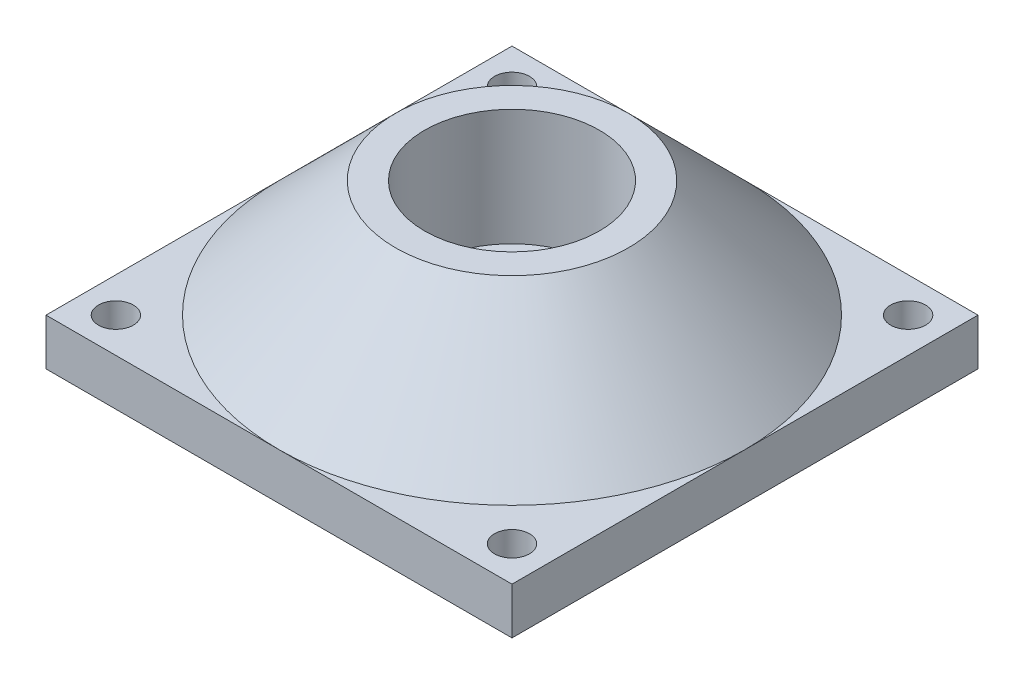
ISO-10303-21;
HEADER;
FILE_DESCRIPTION(('STEP AP214'),'2;1');
FILE_NAME('part.step','',(''),(''),'','','');
FILE_SCHEMA(('AUTOMOTIVE_DESIGN { 1 0 10303 214 1 1 1 1 }'));
ENDSEC;
DATA;
#1=APPLICATION_CONTEXT('core data for automotive mechanical design processes');
#2=APPLICATION_PROTOCOL_DEFINITION('international standard','automotive_design',2000,#1);
#3=PRODUCT_CONTEXT('',#1,'mechanical');
#4=PRODUCT('Part','Part','',(#3));
#5=PRODUCT_RELATED_PRODUCT_CATEGORY('part','',(#4));
#6=PRODUCT_DEFINITION_FORMATION('','',#4);
#7=PRODUCT_DEFINITION_CONTEXT('part definition',#1,'design');
#8=PRODUCT_DEFINITION('design','',#6,#7);
#9=PRODUCT_DEFINITION_SHAPE('','',#8);
#10=(LENGTH_UNIT() NAMED_UNIT(*) SI_UNIT(.MILLI.,.METRE.));
#11=(NAMED_UNIT(*) PLANE_ANGLE_UNIT() SI_UNIT($,.RADIAN.));
#12=(NAMED_UNIT(*) SI_UNIT($,.STERADIAN.) SOLID_ANGLE_UNIT());
#13=UNCERTAINTY_MEASURE_WITH_UNIT(LENGTH_MEASURE(1.E-05),#10,'distance_accuracy_value','');
#14=(GEOMETRIC_REPRESENTATION_CONTEXT(3) GLOBAL_UNCERTAINTY_ASSIGNED_CONTEXT((#13)) GLOBAL_UNIT_ASSIGNED_CONTEXT((#10,
#11,#12)) REPRESENTATION_CONTEXT('',''));
#15=CARTESIAN_POINT('',(0.,0.,0.));
#16=DIRECTION('',(0.,0.,1.));
#17=DIRECTION('',(1.,0.,0.));
#18=AXIS2_PLACEMENT_3D('',#15,#16,#17);
#19=CARTESIAN_POINT('',(0.,20.,0.));
#20=DIRECTION('',(0.,-1.,0.));
#21=DIRECTION('',(0.,0.,-1.));
#22=AXIS2_PLACEMENT_3D('',#19,#20,#21);
#23=PLANE('',#22);
#24=CARTESIAN_POINT('',(85.,20.,-85.));
#25=DIRECTION('',(0.,1.,0.));
#26=DIRECTION('',(0.,0.,1.));
#27=AXIS2_PLACEMENT_3D('',#24,#25,#26);
#28=CIRCLE('',#27,7.50000000000001);
#29=CARTESIAN_POINT('',(85.,20.,-77.5));
#30=VERTEX_POINT('',#29);
#31=EDGE_CURVE('E145',#30,#30,#28,.T.);
#32=ORIENTED_EDGE('',*,*,#31,.F.);
#33=EDGE_LOOP('',(#32));
#34=FACE_BOUND('',#33,.T.);
#35=DIRECTION('',(-1.,0.,0.));
#36=VECTOR('',#35,1.);
#37=CARTESIAN_POINT('',(-100.,20.,-100.));
#38=LINE('',#37,#36);
#39=CARTESIAN_POINT('',(100.,20.,-100.));
#40=VERTEX_POINT('',#39);
#41=CARTESIAN_POINT('',(0.,20.,-100.));
#42=VERTEX_POINT('',#41);
#43=EDGE_CURVE('E100',#40,#42,#38,.T.);
#44=ORIENTED_EDGE('',*,*,#43,.T.);
#45=CARTESIAN_POINT('',(0.,20.,0.));
#46=DIRECTION('',(0.,-1.,0.));
#47=DIRECTION('',(0.,0.,-1.));
#48=AXIS2_PLACEMENT_3D('',#45,#46,#47);
#49=CIRCLE('',#48,99.9999999999997);
#50=CARTESIAN_POINT('',(100.,20.,0.));
#51=VERTEX_POINT('',#50);
#52=EDGE_CURVE('E11',#42,#51,#49,.T.);
#53=ORIENTED_EDGE('',*,*,#52,.T.);
#54=DIRECTION('',(0.,0.,-1.));
#55=VECTOR('',#54,1.);
#56=CARTESIAN_POINT('',(100.,20.,100.));
#57=LINE('',#56,#55);
#58=EDGE_CURVE('E98',#51,#40,#57,.T.);
#59=ORIENTED_EDGE('',*,*,#58,.T.);
#60=EDGE_LOOP('',(#44,#53,#59));
#61=FACE_BOUND('',#60,.T.);
#62=ADVANCED_FACE('F41',(#34,#61),#23,.F.);
#63=CARTESIAN_POINT('',(85.,20.,85.));
#64=DIRECTION('',(0.,1.,0.));
#65=DIRECTION('',(0.,0.,-1.));
#66=AXIS2_PLACEMENT_3D('',#63,#64,#65);
#67=CIRCLE('',#66,7.50000000000001);
#68=CARTESIAN_POINT('',(85.,20.,77.5));
#69=VERTEX_POINT('',#68);
#70=EDGE_CURVE('E256',#69,#69,#67,.T.);
#71=ORIENTED_EDGE('',*,*,#70,.F.);
#72=EDGE_LOOP('',(#71));
#73=FACE_BOUND('',#72,.T.);
#74=CARTESIAN_POINT('',(100.,20.,100.));
#75=VERTEX_POINT('',#74);
#76=EDGE_CURVE('E106',#75,#51,#57,.T.);
#77=ORIENTED_EDGE('',*,*,#76,.T.);
#78=CARTESIAN_POINT('',(0.,20.,0.));
#79=DIRECTION('',(0.,-1.,0.));
#80=DIRECTION('',(0.,0.,-1.));
#81=AXIS2_PLACEMENT_3D('',#78,#79,#80);
#82=CIRCLE('',#81,99.9999999999997);
#83=CARTESIAN_POINT('',(0.,20.,100.));
#84=VERTEX_POINT('',#83);
#85=EDGE_CURVE('E52',#51,#84,#82,.T.);
#86=ORIENTED_EDGE('',*,*,#85,.T.);
#87=DIRECTION('',(1.,0.,0.));
#88=VECTOR('',#87,1.);
#89=CARTESIAN_POINT('',(-100.,20.,100.));
#90=LINE('',#89,#88);
#91=EDGE_CURVE('E178',#84,#75,#90,.T.);
#92=ORIENTED_EDGE('',*,*,#91,.T.);
#93=EDGE_LOOP('',(#77,#86,#92));
#94=FACE_BOUND('',#93,.T.);
#95=ADVANCED_FACE('F235',(#73,#94),#23,.F.);
#96=CARTESIAN_POINT('',(-85.,20.,85.));
#97=DIRECTION('',(0.,1.,0.));
#98=DIRECTION('',(0.,0.,1.));
#99=AXIS2_PLACEMENT_3D('',#96,#97,#98);
#100=CIRCLE('',#99,7.50000000000001);
#101=CARTESIAN_POINT('',(-85.,20.,92.5));
#102=VERTEX_POINT('',#101);
#103=EDGE_CURVE('E262',#102,#102,#100,.T.);
#104=ORIENTED_EDGE('',*,*,#103,.F.);
#105=EDGE_LOOP('',(#104));
#106=FACE_BOUND('',#105,.T.);
#107=CARTESIAN_POINT('',(-100.,20.,100.));
#108=VERTEX_POINT('',#107);
#109=EDGE_CURVE('E179',#108,#84,#90,.T.);
#110=ORIENTED_EDGE('',*,*,#109,.T.);
#111=CARTESIAN_POINT('',(0.,20.,0.));
#112=DIRECTION('',(0.,-1.,0.));
#113=DIRECTION('',(0.,0.,-1.));
#114=AXIS2_PLACEMENT_3D('',#111,#112,#113);
#115=CIRCLE('',#114,99.9999999999997);
#116=CARTESIAN_POINT('',(-100.,20.,0.));
#117=VERTEX_POINT('',#116);
#118=EDGE_CURVE('E67',#84,#117,#115,.T.);
#119=ORIENTED_EDGE('',*,*,#118,.T.);
#120=DIRECTION('',(0.,0.,1.));
#121=VECTOR('',#120,1.);
#122=CARTESIAN_POINT('',(-100.,20.,100.));
#123=LINE('',#122,#121);
#124=EDGE_CURVE('E118',#117,#108,#123,.T.);
#125=ORIENTED_EDGE('',*,*,#124,.T.);
#126=EDGE_LOOP('',(#110,#119,#125));
#127=FACE_BOUND('',#126,.T.);
#128=ADVANCED_FACE('F232',(#106,#127),#23,.F.);
#129=CARTESIAN_POINT('',(100.,20.,100.));
#130=DIRECTION('',(-1.,0.,0.));
#131=DIRECTION('',(0.,0.,1.));
#132=AXIS2_PLACEMENT_3D('',#129,#130,#131);
#133=PLANE('',#132);
#134=DIRECTION('',(0.,0.,-1.));
#135=VECTOR('',#134,1.);
#136=CARTESIAN_POINT('',(100.,0.,100.));
#137=LINE('',#136,#135);
#138=CARTESIAN_POINT('',(100.,0.,100.));
#139=VERTEX_POINT('',#138);
#140=CARTESIAN_POINT('',(100.,0.,-100.));
#141=VERTEX_POINT('',#140);
#142=EDGE_CURVE('E123',#139,#141,#137,.T.);
#143=ORIENTED_EDGE('',*,*,#142,.T.);
#144=DIRECTION('',(0.,-1.,0.));
#145=VECTOR('',#144,1.);
#146=CARTESIAN_POINT('',(100.,20.,-100.));
#147=LINE('',#146,#145);
#148=EDGE_CURVE('E113',#40,#141,#147,.T.);
#149=ORIENTED_EDGE('',*,*,#148,.F.);
#150=ORIENTED_EDGE('',*,*,#58,.F.);
#151=ORIENTED_EDGE('',*,*,#76,.F.);
#152=DIRECTION('',(0.,-1.,0.));
#153=VECTOR('',#152,1.);
#154=CARTESIAN_POINT('',(100.,20.,100.));
#155=LINE('',#154,#153);
#156=EDGE_CURVE('E182',#75,#139,#155,.T.);
#157=ORIENTED_EDGE('',*,*,#156,.T.);
#158=EDGE_LOOP('',(#143,#149,#150,#151,#157));
#159=FACE_BOUND('',#158,.T.);
#160=ADVANCED_FACE('F120',(#159),#133,.F.);
#161=CARTESIAN_POINT('',(-100.,20.,-100.));
#162=DIRECTION('',(0.,0.,1.));
#163=DIRECTION('',(1.,0.,0.));
#164=AXIS2_PLACEMENT_3D('',#161,#162,#163);
#165=PLANE('',#164);
#166=DIRECTION('',(-1.,0.,0.));
#167=VECTOR('',#166,1.);
#168=CARTESIAN_POINT('',(-100.,0.,-100.));
#169=LINE('',#168,#167);
#170=CARTESIAN_POINT('',(-100.,0.,-100.));
#171=VERTEX_POINT('',#170);
#172=EDGE_CURVE('E185',#141,#171,#169,.T.);
#173=ORIENTED_EDGE('',*,*,#172,.T.);
#174=DIRECTION('',(0.,-1.,0.));
#175=VECTOR('',#174,1.);
#176=CARTESIAN_POINT('',(-100.,20.,-100.));
#177=LINE('',#176,#175);
#178=CARTESIAN_POINT('',(-100.,20.,-100.));
#179=VERTEX_POINT('',#178);
#180=EDGE_CURVE('E126',#179,#171,#177,.T.);
#181=ORIENTED_EDGE('',*,*,#180,.F.);
#182=EDGE_CURVE('E116',#42,#179,#38,.T.);
#183=ORIENTED_EDGE('',*,*,#182,.F.);
#184=ORIENTED_EDGE('',*,*,#43,.F.);
#185=ORIENTED_EDGE('',*,*,#148,.T.);
#186=EDGE_LOOP('',(#173,#181,#183,#184,#185));
#187=FACE_BOUND('',#186,.T.);
#188=ADVANCED_FACE('F112',(#187),#165,.F.);
#189=CARTESIAN_POINT('',(-100.,20.,100.));
#190=DIRECTION('',(1.,0.,0.));
#191=DIRECTION('',(0.,0.,-1.));
#192=AXIS2_PLACEMENT_3D('',#189,#190,#191);
#193=PLANE('',#192);
#194=DIRECTION('',(0.,0.,1.));
#195=VECTOR('',#194,1.);
#196=CARTESIAN_POINT('',(-100.,0.,100.));
#197=LINE('',#196,#195);
#198=CARTESIAN_POINT('',(-100.,0.,100.));
#199=VERTEX_POINT('',#198);
#200=EDGE_CURVE('E188',#171,#199,#197,.T.);
#201=ORIENTED_EDGE('',*,*,#200,.T.);
#202=DIRECTION('',(0.,-1.,0.));
#203=VECTOR('',#202,1.);
#204=CARTESIAN_POINT('',(-100.,20.,100.));
#205=LINE('',#204,#203);
#206=EDGE_CURVE('E132',#108,#199,#205,.T.);
#207=ORIENTED_EDGE('',*,*,#206,.F.);
#208=ORIENTED_EDGE('',*,*,#124,.F.);
#209=EDGE_CURVE('E174',#179,#117,#123,.T.);
#210=ORIENTED_EDGE('',*,*,#209,.F.);
#211=ORIENTED_EDGE('',*,*,#180,.T.);
#212=EDGE_LOOP('',(#201,#207,#208,#210,#211));
#213=FACE_BOUND('',#212,.T.);
#214=ADVANCED_FACE('F207',(#213),#193,.F.);
#215=CARTESIAN_POINT('',(-100.,20.,100.));
#216=DIRECTION('',(0.,0.,-1.));
#217=DIRECTION('',(-1.,0.,0.));
#218=AXIS2_PLACEMENT_3D('',#215,#216,#217);
#219=PLANE('',#218);
#220=DIRECTION('',(1.,0.,0.));
#221=VECTOR('',#220,1.);
#222=CARTESIAN_POINT('',(-100.,0.,100.));
#223=LINE('',#222,#221);
#224=EDGE_CURVE('E107',#199,#139,#223,.T.);
#225=ORIENTED_EDGE('',*,*,#224,.T.);
#226=ORIENTED_EDGE('',*,*,#156,.F.);
#227=ORIENTED_EDGE('',*,*,#91,.F.);
#228=ORIENTED_EDGE('',*,*,#109,.F.);
#229=ORIENTED_EDGE('',*,*,#206,.T.);
#230=EDGE_LOOP('',(#225,#226,#227,#228,#229));
#231=FACE_BOUND('',#230,.T.);
#232=ADVANCED_FACE('F200',(#231),#219,.F.);
#233=CARTESIAN_POINT('',(-85.,20.,-85.));
#234=DIRECTION('',(0.,1.,0.));
#235=DIRECTION('',(0.,0.,-1.));
#236=AXIS2_PLACEMENT_3D('',#233,#234,#235);
#237=CIRCLE('',#236,7.50000000000001);
#238=CARTESIAN_POINT('',(-85.,20.,-92.5));
#239=VERTEX_POINT('',#238);
#240=EDGE_CURVE('E253',#239,#239,#237,.T.);
#241=ORIENTED_EDGE('',*,*,#240,.F.);
#242=EDGE_LOOP('',(#241));
#243=FACE_BOUND('',#242,.T.);
#244=ORIENTED_EDGE('',*,*,#209,.T.);
#245=CARTESIAN_POINT('',(0.,20.,0.));
#246=DIRECTION('',(0.,-1.,0.));
#247=DIRECTION('',(0.,0.,-1.));
#248=AXIS2_PLACEMENT_3D('',#245,#246,#247);
#249=CIRCLE('',#248,99.9999999999997);
#250=EDGE_CURVE('E125',#117,#42,#249,.T.);
#251=ORIENTED_EDGE('',*,*,#250,.T.);
#252=ORIENTED_EDGE('',*,*,#182,.T.);
#253=EDGE_LOOP('',(#244,#251,#252));
#254=FACE_BOUND('',#253,.T.);
#255=ADVANCED_FACE('F210',(#243,#254),#23,.F.);
#256=CARTESIAN_POINT('',(0.,0.,0.));
#257=DIRECTION('',(0.,-1.,0.));
#258=DIRECTION('',(0.,0.,-1.));
#259=AXIS2_PLACEMENT_3D('',#256,#257,#258);
#260=PLANE('',#259);
#261=CARTESIAN_POINT('',(-85.,0.,-85.));
#262=DIRECTION('',(0.,-1.,0.));
#263=DIRECTION('',(0.,0.,-1.));
#264=AXIS2_PLACEMENT_3D('',#261,#262,#263);
#265=CIRCLE('',#264,7.50000000000001);
#266=CARTESIAN_POINT('',(-85.,0.,-92.5));
#267=VERTEX_POINT('',#266);
#268=EDGE_CURVE('E46',#267,#267,#265,.T.);
#269=ORIENTED_EDGE('',*,*,#268,.F.);
#270=EDGE_LOOP('',(#269));
#271=FACE_BOUND('',#270,.T.);
#272=CARTESIAN_POINT('',(85.,0.,85.));
#273=DIRECTION('',(0.,-1.,0.));
#274=DIRECTION('',(0.,0.,-1.));
#275=AXIS2_PLACEMENT_3D('',#272,#273,#274);
#276=CIRCLE('',#275,7.50000000000001);
#277=CARTESIAN_POINT('',(85.,0.,77.5));
#278=VERTEX_POINT('',#277);
#279=EDGE_CURVE('E148',#278,#278,#276,.T.);
#280=ORIENTED_EDGE('',*,*,#279,.F.);
#281=EDGE_LOOP('',(#280));
#282=FACE_BOUND('',#281,.T.);
#283=CARTESIAN_POINT('',(-85.,0.,85.));
#284=DIRECTION('',(0.,-1.,0.));
#285=DIRECTION('',(0.,0.,-1.));
#286=AXIS2_PLACEMENT_3D('',#283,#284,#285);
#287=CIRCLE('',#286,7.50000000000001);
#288=CARTESIAN_POINT('',(-85.,0.,77.5));
#289=VERTEX_POINT('',#288);
#290=EDGE_CURVE('E144',#289,#289,#287,.T.);
#291=ORIENTED_EDGE('',*,*,#290,.F.);
#292=EDGE_LOOP('',(#291));
#293=FACE_BOUND('',#292,.T.);
#294=CARTESIAN_POINT('',(85.,0.,-85.));
#295=DIRECTION('',(0.,-1.,0.));
#296=DIRECTION('',(0.,0.,-1.));
#297=AXIS2_PLACEMENT_3D('',#294,#295,#296);
#298=CIRCLE('',#297,7.50000000000001);
#299=CARTESIAN_POINT('',(85.,0.,-92.5));
#300=VERTEX_POINT('',#299);
#301=EDGE_CURVE('E140',#300,#300,#298,.T.);
#302=ORIENTED_EDGE('',*,*,#301,.F.);
#303=EDGE_LOOP('',(#302));
#304=FACE_BOUND('',#303,.T.);
#305=ORIENTED_EDGE('',*,*,#142,.F.);
#306=ORIENTED_EDGE('',*,*,#224,.F.);
#307=ORIENTED_EDGE('',*,*,#200,.F.);
#308=ORIENTED_EDGE('',*,*,#172,.F.);
#309=EDGE_LOOP('',(#305,#306,#307,#308));
#310=FACE_BOUND('',#309,.T.);
#311=ADVANCED_FACE('F205',(#271,#282,#293,#304,#310),#260,.T.);
#312=CARTESIAN_POINT('',(0.,70.,0.));
#313=DIRECTION('',(0.,1.,0.));
#314=DIRECTION('',(0.,0.,1.));
#315=AXIS2_PLACEMENT_3D('',#312,#313,#314);
#316=PLANE('',#315);
#317=CARTESIAN_POINT('',(0.,70.,0.));
#318=DIRECTION('',(0.,1.,0.));
#319=DIRECTION('',(0.,0.,1.));
#320=AXIS2_PLACEMENT_3D('',#317,#318,#319);
#321=CIRCLE('',#320,50.);
#322=CARTESIAN_POINT('',(0.,70.,50.));
#323=VERTEX_POINT('',#322);
#324=EDGE_CURVE('E166',#323,#323,#321,.T.);
#325=ORIENTED_EDGE('',*,*,#324,.T.);
#326=EDGE_LOOP('',(#325));
#327=FACE_BOUND('',#326,.T.);
#328=CARTESIAN_POINT('',(0.,70.,0.));
#329=DIRECTION('',(0.,1.,0.));
#330=DIRECTION('',(0.,0.,1.));
#331=AXIS2_PLACEMENT_3D('',#328,#329,#330);
#332=CIRCLE('',#331,37.5);
#333=CARTESIAN_POINT('',(0.,70.,37.5));
#334=VERTEX_POINT('',#333);
#335=EDGE_CURVE('E160',#334,#334,#332,.T.);
#336=ORIENTED_EDGE('',*,*,#335,.F.);
#337=EDGE_LOOP('',(#336));
#338=FACE_BOUND('',#337,.T.);
#339=ADVANCED_FACE('F218',(#327,#338),#316,.T.);
#340=CARTESIAN_POINT('',(0.,70.,0.));
#341=DIRECTION('',(0.,-1.,0.));
#342=DIRECTION('',(0.,0.,-1.));
#343=AXIS2_PLACEMENT_3D('',#340,#341,#342);
#344=CYLINDRICAL_SURFACE('',#343,37.5);
#345=ORIENTED_EDGE('',*,*,#335,.T.);
#346=EDGE_LOOP('',(#345));
#347=FACE_BOUND('',#346,.T.);
#348=CARTESIAN_POINT('',(0.,20.,0.));
#349=DIRECTION('',(0.,1.,0.));
#350=DIRECTION('',(0.,0.,1.));
#351=AXIS2_PLACEMENT_3D('',#348,#349,#350);
#352=CIRCLE('',#351,37.5);
#353=CARTESIAN_POINT('',(0.,20.,37.5));
#354=VERTEX_POINT('',#353);
#355=EDGE_CURVE('E155',#354,#354,#352,.T.);
#356=ORIENTED_EDGE('',*,*,#355,.F.);
#357=EDGE_LOOP('',(#356));
#358=FACE_BOUND('',#357,.T.);
#359=ADVANCED_FACE('F221',(#347,#358),#344,.F.);
#360=ORIENTED_EDGE('',*,*,#355,.T.);
#361=EDGE_LOOP('',(#360));
#362=FACE_BOUND('',#361,.T.);
#363=ADVANCED_FACE('F215',(#362),#23,.F.);
#364=CARTESIAN_POINT('',(0.,70.0000000000003,0.));
#365=DIRECTION('',(0.,-1.,0.));
#366=DIRECTION('',(0.,0.,-1.));
#367=AXIS2_PLACEMENT_3D('',#364,#365,#366);
#368=CONICAL_SURFACE('',#367,50.,0.785398163397443);
#369=ORIENTED_EDGE('',*,*,#85,.F.);
#370=ORIENTED_EDGE('',*,*,#52,.F.);
#371=ORIENTED_EDGE('',*,*,#250,.F.);
#372=ORIENTED_EDGE('',*,*,#118,.F.);
#373=EDGE_LOOP('',(#369,#370,#371,#372));
#374=FACE_BOUND('',#373,.T.);
#375=ORIENTED_EDGE('',*,*,#324,.F.);
#376=EDGE_LOOP('',(#375));
#377=FACE_BOUND('',#376,.T.);
#378=ADVANCED_FACE('F44',(#374,#377),#368,.T.);
#379=CARTESIAN_POINT('',(85.,-30.,-85.));
#380=DIRECTION('',(0.,1.,0.));
#381=DIRECTION('',(0.,0.,1.));
#382=AXIS2_PLACEMENT_3D('',#379,#380,#381);
#383=CYLINDRICAL_SURFACE('',#382,7.50000000000001);
#384=ORIENTED_EDGE('',*,*,#301,.T.);
#385=EDGE_LOOP('',(#384));
#386=FACE_BOUND('',#385,.T.);
#387=ORIENTED_EDGE('',*,*,#31,.T.);
#388=EDGE_LOOP('',(#387));
#389=FACE_BOUND('',#388,.T.);
#390=ADVANCED_FACE('F214',(#386,#389),#383,.F.);
#391=CARTESIAN_POINT('',(-85.,-30.,85.));
#392=DIRECTION('',(0.,1.,0.));
#393=DIRECTION('',(0.,0.,1.));
#394=AXIS2_PLACEMENT_3D('',#391,#392,#393);
#395=CYLINDRICAL_SURFACE('',#394,7.50000000000001);
#396=ORIENTED_EDGE('',*,*,#290,.T.);
#397=EDGE_LOOP('',(#396));
#398=FACE_BOUND('',#397,.T.);
#399=ORIENTED_EDGE('',*,*,#103,.T.);
#400=EDGE_LOOP('',(#399));
#401=FACE_BOUND('',#400,.T.);
#402=ADVANCED_FACE('F269',(#398,#401),#395,.F.);
#403=CARTESIAN_POINT('',(85.,-30.,85.));
#404=DIRECTION('',(0.,1.,0.));
#405=DIRECTION('',(0.,0.,1.));
#406=AXIS2_PLACEMENT_3D('',#403,#404,#405);
#407=CYLINDRICAL_SURFACE('',#406,7.50000000000001);
#408=ORIENTED_EDGE('',*,*,#279,.T.);
#409=EDGE_LOOP('',(#408));
#410=FACE_BOUND('',#409,.T.);
#411=ORIENTED_EDGE('',*,*,#70,.T.);
#412=EDGE_LOOP('',(#411));
#413=FACE_BOUND('',#412,.T.);
#414=ADVANCED_FACE('F341',(#410,#413),#407,.F.);
#415=CARTESIAN_POINT('',(-85.,-30.,-85.));
#416=DIRECTION('',(0.,1.,0.));
#417=DIRECTION('',(0.,0.,1.));
#418=AXIS2_PLACEMENT_3D('',#415,#416,#417);
#419=CYLINDRICAL_SURFACE('',#418,7.50000000000001);
#420=ORIENTED_EDGE('',*,*,#268,.T.);
#421=EDGE_LOOP('',(#420));
#422=FACE_BOUND('',#421,.T.);
#423=ORIENTED_EDGE('',*,*,#240,.T.);
#424=EDGE_LOOP('',(#423));
#425=FACE_BOUND('',#424,.T.);
#426=ADVANCED_FACE('F351',(#422,#425),#419,.F.);
#427=CLOSED_SHELL('',(#62,#95,#128,#160,#188,#214,#232,#255,#311,#339,#359,#363,#378,#390,#402,
#414,#426));
#428=MANIFOLD_SOLID_BREP('B2',#427);
#429=ADVANCED_BREP_SHAPE_REPRESENTATION('',(#18,#428),#14);
#430=SHAPE_DEFINITION_REPRESENTATION(#9,#429);
ENDSEC;
END-ISO-10303-21;
